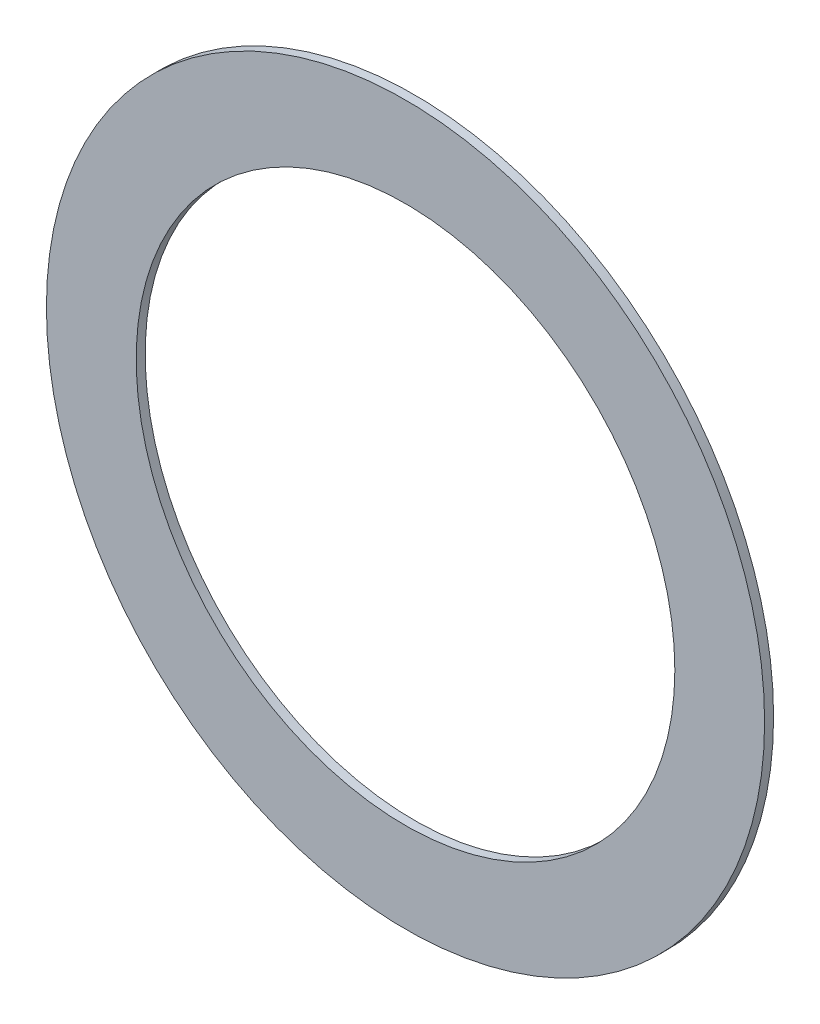
ISO-10303-21;
HEADER;
FILE_DESCRIPTION(('STEP AP214'),'2;1');
FILE_NAME('part.step','',(''),(''),'','','');
FILE_SCHEMA(('AUTOMOTIVE_DESIGN { 1 0 10303 214 1 1 1 1 }'));
ENDSEC;
DATA;
#1=APPLICATION_CONTEXT('core data for automotive mechanical design processes');
#2=APPLICATION_PROTOCOL_DEFINITION('international standard','automotive_design',2000,#1);
#3=PRODUCT_CONTEXT('',#1,'mechanical');
#4=PRODUCT('Part','Part','',(#3));
#5=PRODUCT_RELATED_PRODUCT_CATEGORY('part','',(#4));
#6=PRODUCT_DEFINITION_FORMATION('','',#4);
#7=PRODUCT_DEFINITION_CONTEXT('part definition',#1,'design');
#8=PRODUCT_DEFINITION('design','',#6,#7);
#9=PRODUCT_DEFINITION_SHAPE('','',#8);
#10=(LENGTH_UNIT() NAMED_UNIT(*) SI_UNIT(.MILLI.,.METRE.));
#11=(NAMED_UNIT(*) PLANE_ANGLE_UNIT() SI_UNIT($,.RADIAN.));
#12=(NAMED_UNIT(*) SI_UNIT($,.STERADIAN.) SOLID_ANGLE_UNIT());
#13=UNCERTAINTY_MEASURE_WITH_UNIT(LENGTH_MEASURE(1.E-05),#10,'distance_accuracy_value','');
#14=(GEOMETRIC_REPRESENTATION_CONTEXT(3) GLOBAL_UNCERTAINTY_ASSIGNED_CONTEXT((#13)) GLOBAL_UNIT_ASSIGNED_CONTEXT((#10,
#11,#12)) REPRESENTATION_CONTEXT('',''));
#15=CARTESIAN_POINT('',(0.,0.,0.));
#16=DIRECTION('',(0.,0.,1.));
#17=DIRECTION('',(1.,0.,0.));
#18=AXIS2_PLACEMENT_3D('',#15,#16,#17);
#19=CARTESIAN_POINT('',(0.,0.,0.1));
#20=DIRECTION('',(0.,0.,1.));
#21=DIRECTION('',(1.,0.,0.));
#22=AXIS2_PLACEMENT_3D('',#19,#20,#21);
#23=PLANE('',#22);
#24=CARTESIAN_POINT('',(0.,0.,0.1));
#25=DIRECTION('',(0.,0.,1.));
#26=DIRECTION('',(1.,0.,0.));
#27=AXIS2_PLACEMENT_3D('',#24,#25,#26);
#28=CIRCLE('',#27,8.);
#29=CARTESIAN_POINT('',(8.,0.,0.1));
#30=VERTEX_POINT('',#29);
#31=EDGE_CURVE('E10',#30,#30,#28,.T.);
#32=ORIENTED_EDGE('',*,*,#31,.T.);
#33=EDGE_LOOP('',(#32));
#34=FACE_BOUND('',#33,.T.);
#35=CARTESIAN_POINT('',(0.,0.,0.1));
#36=DIRECTION('',(0.,0.,1.));
#37=DIRECTION('',(1.,0.,0.));
#38=AXIS2_PLACEMENT_3D('',#35,#36,#37);
#39=CIRCLE('',#38,6.);
#40=CARTESIAN_POINT('',(6.,0.,0.1));
#41=VERTEX_POINT('',#40);
#42=EDGE_CURVE('E42',#41,#41,#39,.T.);
#43=ORIENTED_EDGE('',*,*,#42,.F.);
#44=EDGE_LOOP('',(#43));
#45=FACE_BOUND('',#44,.T.);
#46=ADVANCED_FACE('F31',(#34,#45),#23,.T.);
#47=CARTESIAN_POINT('',(0.,0.,-0.1));
#48=DIRECTION('',(0.,0.,1.));
#49=DIRECTION('',(1.,0.,0.));
#50=AXIS2_PLACEMENT_3D('',#47,#48,#49);
#51=PLANE('',#50);
#52=CARTESIAN_POINT('',(0.,0.,-0.1));
#53=DIRECTION('',(0.,0.,1.));
#54=DIRECTION('',(1.,0.,0.));
#55=AXIS2_PLACEMENT_3D('',#52,#53,#54);
#56=CIRCLE('',#55,8.);
#57=CARTESIAN_POINT('',(8.,0.,-0.1));
#58=VERTEX_POINT('',#57);
#59=EDGE_CURVE('E35',#58,#58,#56,.T.);
#60=ORIENTED_EDGE('',*,*,#59,.F.);
#61=EDGE_LOOP('',(#60));
#62=FACE_BOUND('',#61,.T.);
#63=CARTESIAN_POINT('',(0.,0.,-0.1));
#64=DIRECTION('',(0.,0.,1.));
#65=DIRECTION('',(1.,0.,0.));
#66=AXIS2_PLACEMENT_3D('',#63,#64,#65);
#67=CIRCLE('',#66,6.);
#68=CARTESIAN_POINT('',(6.,0.,-0.1));
#69=VERTEX_POINT('',#68);
#70=EDGE_CURVE('E44',#69,#69,#67,.T.);
#71=ORIENTED_EDGE('',*,*,#70,.T.);
#72=EDGE_LOOP('',(#71));
#73=FACE_BOUND('',#72,.T.);
#74=ADVANCED_FACE('F54',(#62,#73),#51,.F.);
#75=CARTESIAN_POINT('',(0.,0.,0.1));
#76=DIRECTION('',(0.,0.,-1.));
#77=DIRECTION('',(-1.,0.,0.));
#78=AXIS2_PLACEMENT_3D('',#75,#76,#77);
#79=CYLINDRICAL_SURFACE('',#78,8.);
#80=ORIENTED_EDGE('',*,*,#31,.F.);
#81=EDGE_LOOP('',(#80));
#82=FACE_BOUND('',#81,.T.);
#83=ORIENTED_EDGE('',*,*,#59,.T.);
#84=EDGE_LOOP('',(#83));
#85=FACE_BOUND('',#84,.T.);
#86=ADVANCED_FACE('F33',(#82,#85),#79,.T.);
#87=CARTESIAN_POINT('',(0.,0.,0.1));
#88=DIRECTION('',(0.,0.,-1.));
#89=DIRECTION('',(-1.,0.,0.));
#90=AXIS2_PLACEMENT_3D('',#87,#88,#89);
#91=CYLINDRICAL_SURFACE('',#90,6.);
#92=ORIENTED_EDGE('',*,*,#42,.T.);
#93=EDGE_LOOP('',(#92));
#94=FACE_BOUND('',#93,.T.);
#95=ORIENTED_EDGE('',*,*,#70,.F.);
#96=EDGE_LOOP('',(#95));
#97=FACE_BOUND('',#96,.T.);
#98=ADVANCED_FACE('F50',(#94,#97),#91,.F.);
#99=CLOSED_SHELL('',(#46,#74,#86,#98));
#100=MANIFOLD_SOLID_BREP('B2',#99);
#101=ADVANCED_BREP_SHAPE_REPRESENTATION('',(#18,#100),#14);
#102=SHAPE_DEFINITION_REPRESENTATION(#9,#101);
ENDSEC;
END-ISO-10303-21;
